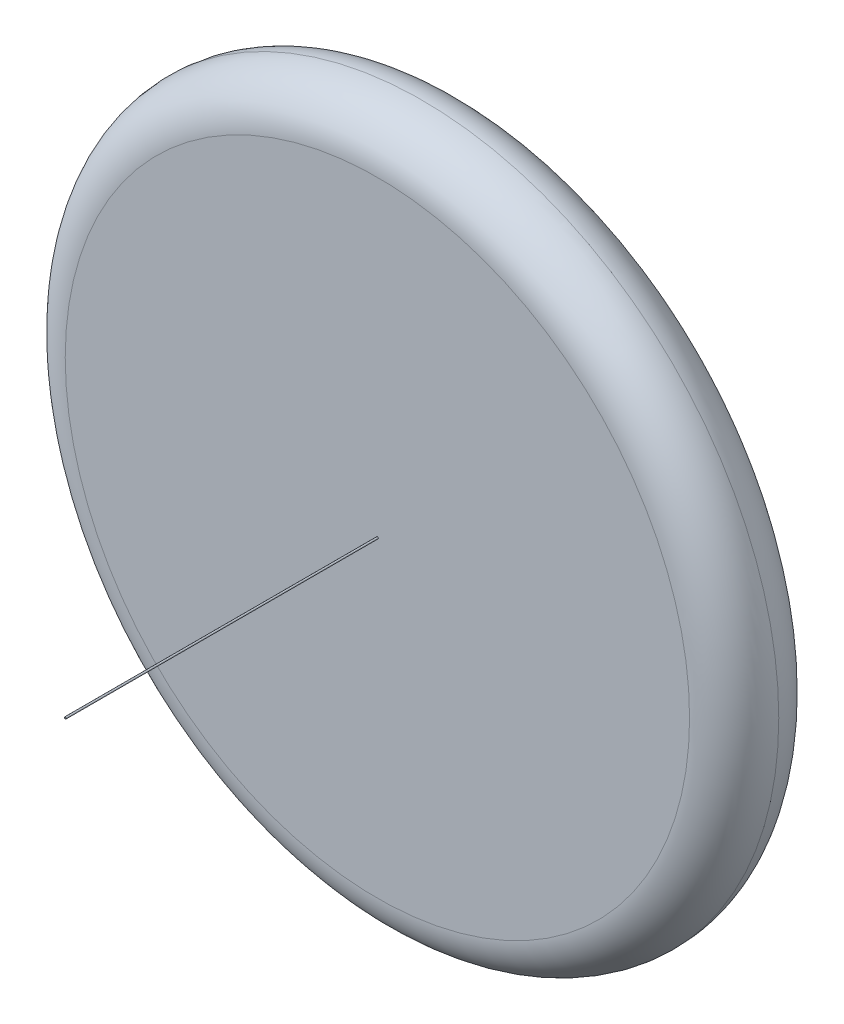
ISO-10303-21;
HEADER;
FILE_DESCRIPTION(('STEP AP214'),'2;1');
FILE_NAME('part.step','',(''),(''),'','','');
FILE_SCHEMA(('AUTOMOTIVE_DESIGN { 1 0 10303 214 1 1 1 1 }'));
ENDSEC;
DATA;
#1=APPLICATION_CONTEXT('core data for automotive mechanical design processes');
#2=APPLICATION_PROTOCOL_DEFINITION('international standard','automotive_design',2000,#1);
#3=PRODUCT_CONTEXT('',#1,'mechanical');
#4=PRODUCT('Part','Part','',(#3));
#5=PRODUCT_RELATED_PRODUCT_CATEGORY('part','',(#4));
#6=PRODUCT_DEFINITION_FORMATION('','',#4);
#7=PRODUCT_DEFINITION_CONTEXT('part definition',#1,'design');
#8=PRODUCT_DEFINITION('design','',#6,#7);
#9=PRODUCT_DEFINITION_SHAPE('','',#8);
#10=(LENGTH_UNIT() NAMED_UNIT(*) SI_UNIT(.MILLI.,.METRE.));
#11=(NAMED_UNIT(*) PLANE_ANGLE_UNIT() SI_UNIT($,.RADIAN.));
#12=(NAMED_UNIT(*) SI_UNIT($,.STERADIAN.) SOLID_ANGLE_UNIT());
#13=UNCERTAINTY_MEASURE_WITH_UNIT(LENGTH_MEASURE(1.E-05),#10,'distance_accuracy_value','');
#14=(GEOMETRIC_REPRESENTATION_CONTEXT(3) GLOBAL_UNCERTAINTY_ASSIGNED_CONTEXT((#13)) GLOBAL_UNIT_ASSIGNED_CONTEXT((#10,
#11,#12)) REPRESENTATION_CONTEXT('',''));
#15=CARTESIAN_POINT('',(0.,0.,0.));
#16=DIRECTION('',(0.,0.,1.));
#17=DIRECTION('',(1.,0.,0.));
#18=AXIS2_PLACEMENT_3D('',#15,#16,#17);
#19=CARTESIAN_POINT('',(0.,0.,2.));
#20=DIRECTION('',(0.,0.,1.));
#21=DIRECTION('',(1.,0.,0.));
#22=AXIS2_PLACEMENT_3D('',#19,#20,#21);
#23=PLANE('',#22);
#24=CARTESIAN_POINT('',(0.,0.,2.));
#25=DIRECTION('',(0.,0.,1.));
#26=DIRECTION('',(1.,0.,0.));
#27=AXIS2_PLACEMENT_3D('',#24,#25,#26);
#28=CIRCLE('',#27,0.02);
#29=CARTESIAN_POINT('',(0.02,0.,2.));
#30=VERTEX_POINT('',#29);
#31=EDGE_CURVE('E57',#30,#30,#28,.T.);
#32=ORIENTED_EDGE('',*,*,#31,.F.);
#33=EDGE_LOOP('',(#32));
#34=FACE_BOUND('',#33,.T.);
#35=CARTESIAN_POINT('',(0.,0.,2.));
#36=DIRECTION('',(0.,0.,1.));
#37=DIRECTION('',(1.,0.,0.));
#38=AXIS2_PLACEMENT_3D('',#35,#36,#37);
#39=CIRCLE('',#38,7.);
#40=CARTESIAN_POINT('',(7.,0.,2.));
#41=VERTEX_POINT('',#40);
#42=EDGE_CURVE('E10',#41,#41,#39,.T.);
#43=ORIENTED_EDGE('',*,*,#42,.T.);
#44=EDGE_LOOP('',(#43));
#45=FACE_BOUND('',#44,.T.);
#46=ADVANCED_FACE('F41',(#34,#45),#23,.T.);
#47=CARTESIAN_POINT('',(0.,0.,0.));
#48=DIRECTION('',(0.,0.,1.));
#49=DIRECTION('',(1.,0.,0.));
#50=AXIS2_PLACEMENT_3D('',#47,#48,#49);
#51=PLANE('',#50);
#52=CARTESIAN_POINT('',(0.,0.,0.));
#53=DIRECTION('',(0.,0.,1.));
#54=DIRECTION('',(1.,0.,0.));
#55=AXIS2_PLACEMENT_3D('',#52,#53,#54);
#56=CIRCLE('',#55,7.);
#57=CARTESIAN_POINT('',(7.,0.,0.));
#58=VERTEX_POINT('',#57);
#59=EDGE_CURVE('E50',#58,#58,#56,.F.);
#60=ORIENTED_EDGE('',*,*,#59,.T.);
#61=EDGE_LOOP('',(#60));
#62=FACE_BOUND('',#61,.T.);
#63=ADVANCED_FACE('F73',(#62),#51,.F.);
#64=CARTESIAN_POINT('',(0.,0.,1.));
#65=DIRECTION('',(0.,0.,1.));
#66=DIRECTION('',(1.,0.,0.));
#67=AXIS2_PLACEMENT_3D('',#64,#65,#66);
#68=TOROIDAL_SURFACE('',#67,7.,1.);
#69=ORIENTED_EDGE('',*,*,#42,.F.);
#70=EDGE_LOOP('',(#69));
#71=FACE_BOUND('',#70,.T.);
#72=CARTESIAN_POINT('',(0.,0.,1.));
#73=DIRECTION('',(0.,0.,1.));
#74=DIRECTION('',(1.,0.,0.));
#75=AXIS2_PLACEMENT_3D('',#72,#73,#74);
#76=CIRCLE('',#75,8.);
#77=CARTESIAN_POINT('',(8.,0.,1.));
#78=VERTEX_POINT('',#77);
#79=EDGE_CURVE('E45',#78,#78,#76,.F.);
#80=ORIENTED_EDGE('',*,*,#79,.F.);
#81=EDGE_LOOP('',(#80));
#82=FACE_BOUND('',#81,.T.);
#83=ADVANCED_FACE('F43',(#71,#82),#68,.T.);
#84=CARTESIAN_POINT('',(0.,0.,1.));
#85=DIRECTION('',(0.,0.,1.));
#86=DIRECTION('',(1.,0.,0.));
#87=AXIS2_PLACEMENT_3D('',#84,#85,#86);
#88=TOROIDAL_SURFACE('',#87,7.,1.);
#89=ORIENTED_EDGE('',*,*,#59,.F.);
#90=EDGE_LOOP('',(#89));
#91=FACE_BOUND('',#90,.T.);
#92=ORIENTED_EDGE('',*,*,#79,.T.);
#93=EDGE_LOOP('',(#92));
#94=FACE_BOUND('',#93,.T.);
#95=ADVANCED_FACE('F70',(#91,#94),#88,.T.);
#96=CARTESIAN_POINT('',(0.,0.,9.));
#97=DIRECTION('',(0.,0.,-1.));
#98=DIRECTION('',(-1.,0.,0.));
#99=AXIS2_PLACEMENT_3D('',#96,#97,#98);
#100=CYLINDRICAL_SURFACE('',#99,0.02);
#101=CARTESIAN_POINT('',(0.,0.,9.));
#102=DIRECTION('',(0.,0.,1.));
#103=DIRECTION('',(1.,0.,0.));
#104=AXIS2_PLACEMENT_3D('',#101,#102,#103);
#105=CIRCLE('',#104,0.02);
#106=CARTESIAN_POINT('',(0.02,0.,9.));
#107=VERTEX_POINT('',#106);
#108=EDGE_CURVE('E61',#107,#107,#105,.T.);
#109=ORIENTED_EDGE('',*,*,#108,.F.);
#110=EDGE_LOOP('',(#109));
#111=FACE_BOUND('',#110,.T.);
#112=ORIENTED_EDGE('',*,*,#31,.T.);
#113=EDGE_LOOP('',(#112));
#114=FACE_BOUND('',#113,.T.);
#115=ADVANCED_FACE('F79',(#111,#114),#100,.T.);
#116=CARTESIAN_POINT('',(0.,0.,9.));
#117=DIRECTION('',(0.,0.,1.));
#118=DIRECTION('',(1.,0.,0.));
#119=AXIS2_PLACEMENT_3D('',#116,#117,#118);
#120=PLANE('',#119);
#121=ORIENTED_EDGE('',*,*,#108,.T.);
#122=EDGE_LOOP('',(#121));
#123=FACE_BOUND('',#122,.T.);
#124=ADVANCED_FACE('F92',(#123),#120,.T.);
#125=CLOSED_SHELL('',(#46,#63,#83,#95,#115,#124));
#126=MANIFOLD_SOLID_BREP('B2',#125);
#127=ADVANCED_BREP_SHAPE_REPRESENTATION('',(#18,#126),#14);
#128=SHAPE_DEFINITION_REPRESENTATION(#9,#127);
ENDSEC;
END-ISO-10303-21;
